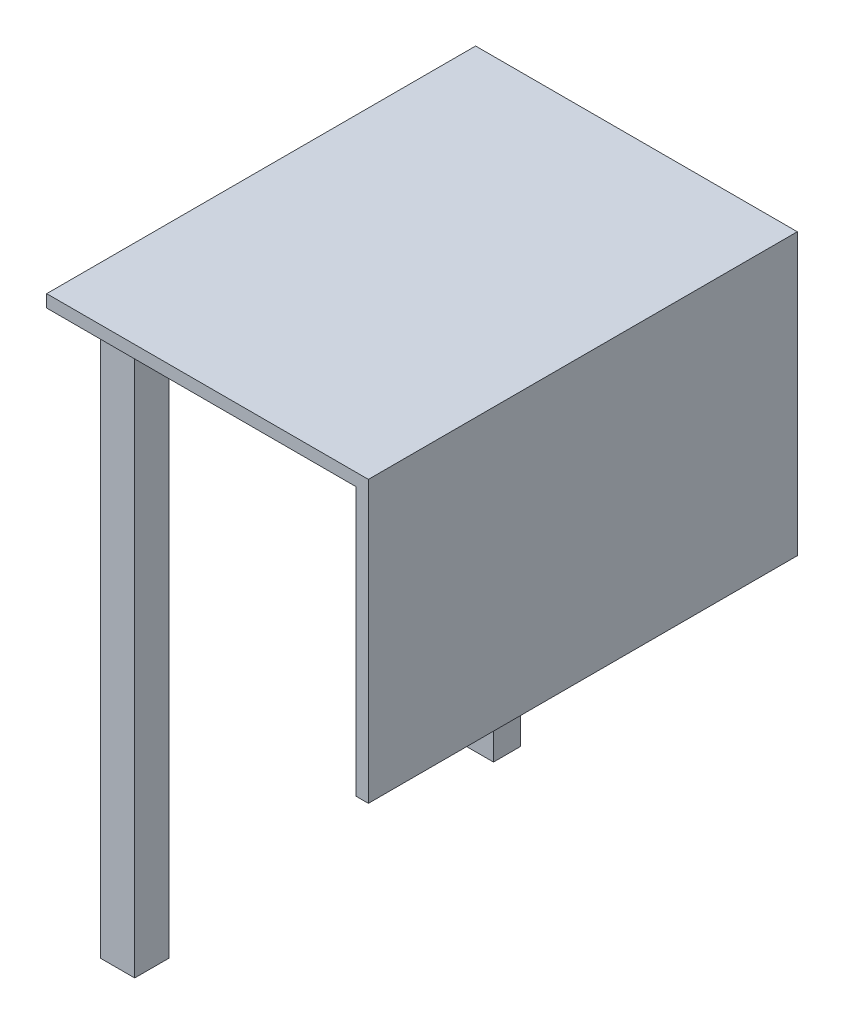
ISO-10303-21;
HEADER;
FILE_DESCRIPTION(('STEP AP214'),'2;1');
FILE_NAME('part.step','',(''),(''),'','','');
FILE_SCHEMA(('AUTOMOTIVE_DESIGN { 1 0 10303 214 1 1 1 1 }'));
ENDSEC;
DATA;
#1=APPLICATION_CONTEXT('core data for automotive mechanical design processes');
#2=APPLICATION_PROTOCOL_DEFINITION('international standard','automotive_design',2000,#1);
#3=PRODUCT_CONTEXT('',#1,'mechanical');
#4=PRODUCT('Part','Part','',(#3));
#5=PRODUCT_RELATED_PRODUCT_CATEGORY('part','',(#4));
#6=PRODUCT_DEFINITION_FORMATION('','',#4);
#7=PRODUCT_DEFINITION_CONTEXT('part definition',#1,'design');
#8=PRODUCT_DEFINITION('design','',#6,#7);
#9=PRODUCT_DEFINITION_SHAPE('','',#8);
#10=(LENGTH_UNIT() NAMED_UNIT(*) SI_UNIT(.MILLI.,.METRE.));
#11=(NAMED_UNIT(*) PLANE_ANGLE_UNIT() SI_UNIT($,.RADIAN.));
#12=(NAMED_UNIT(*) SI_UNIT($,.STERADIAN.) SOLID_ANGLE_UNIT());
#13=UNCERTAINTY_MEASURE_WITH_UNIT(LENGTH_MEASURE(1.E-05),#10,'distance_accuracy_value','');
#14=(GEOMETRIC_REPRESENTATION_CONTEXT(3) GLOBAL_UNCERTAINTY_ASSIGNED_CONTEXT((#13)) GLOBAL_UNIT_ASSIGNED_CONTEXT((#10,
#11,#12)) REPRESENTATION_CONTEXT('',''));
#15=CARTESIAN_POINT('',(0.,0.,0.));
#16=DIRECTION('',(0.,0.,1.));
#17=DIRECTION('',(1.,0.,0.));
#18=AXIS2_PLACEMENT_3D('',#15,#16,#17);
#19=CARTESIAN_POINT('',(0.,17.78,0.));
#20=DIRECTION('',(0.,1.,0.));
#21=DIRECTION('',(0.,0.,1.));
#22=AXIS2_PLACEMENT_3D('',#19,#20,#21);
#23=PLANE('',#22);
#24=DIRECTION('',(0.,0.,-1.));
#25=VECTOR('',#24,1.);
#26=CARTESIAN_POINT('',(228.6,17.78,-304.8));
#27=LINE('',#26,#25);
#28=CARTESIAN_POINT('',(228.6,17.78,304.8));
#29=VERTEX_POINT('',#28);
#30=CARTESIAN_POINT('',(228.6,17.78,-304.8));
#31=VERTEX_POINT('',#30);
#32=EDGE_CURVE('E241',#29,#31,#27,.T.);
#33=ORIENTED_EDGE('',*,*,#32,.T.);
#34=DIRECTION('',(-1.,0.,0.));
#35=VECTOR('',#34,1.);
#36=CARTESIAN_POINT('',(-228.6,17.78,-304.8));
#37=LINE('',#36,#35);
#38=CARTESIAN_POINT('',(-228.6,17.78,-304.8));
#39=VERTEX_POINT('',#38);
#40=EDGE_CURVE('E82',#31,#39,#37,.T.);
#41=ORIENTED_EDGE('',*,*,#40,.T.);
#42=DIRECTION('',(0.,0.,1.));
#43=VECTOR('',#42,1.);
#44=CARTESIAN_POINT('',(-228.6,17.78,-304.8));
#45=LINE('',#44,#43);
#46=CARTESIAN_POINT('',(-228.6,17.78,304.8));
#47=VERTEX_POINT('',#46);
#48=EDGE_CURVE('E245',#39,#47,#45,.T.);
#49=ORIENTED_EDGE('',*,*,#48,.T.);
#50=DIRECTION('',(1.,0.,0.));
#51=VECTOR('',#50,1.);
#52=CARTESIAN_POINT('',(-228.6,17.78,304.8));
#53=LINE('',#52,#51);
#54=EDGE_CURVE('E59',#47,#29,#53,.T.);
#55=ORIENTED_EDGE('',*,*,#54,.T.);
#56=EDGE_LOOP('',(#33,#41,#49,#55));
#57=FACE_BOUND('',#56,.T.);
#58=ADVANCED_FACE('F35',(#57),#23,.T.);
#59=CARTESIAN_POINT('',(0.,0.,0.));
#60=DIRECTION('',(0.,1.,0.));
#61=DIRECTION('',(0.,0.,1.));
#62=AXIS2_PLACEMENT_3D('',#59,#60,#61);
#63=PLANE('',#62);
#64=DIRECTION('',(0.,0.,-1.));
#65=VECTOR('',#64,1.);
#66=CARTESIAN_POINT('',(-139.7,0.,-279.4));
#67=LINE('',#66,#65);
#68=CARTESIAN_POINT('',(-139.7,0.,-241.3));
#69=VERTEX_POINT('',#68);
#70=CARTESIAN_POINT('',(-139.7,0.,-279.4));
#71=VERTEX_POINT('',#70);
#72=EDGE_CURVE('E228',#69,#71,#67,.T.);
#73=ORIENTED_EDGE('',*,*,#72,.T.);
#74=DIRECTION('',(-1.,0.,0.));
#75=VECTOR('',#74,1.);
#76=CARTESIAN_POINT('',(-177.8,0.,-279.4));
#77=LINE('',#76,#75);
#78=CARTESIAN_POINT('',(-177.8,0.,-279.4));
#79=VERTEX_POINT('',#78);
#80=EDGE_CURVE('E231',#71,#79,#77,.T.);
#81=ORIENTED_EDGE('',*,*,#80,.T.);
#82=DIRECTION('',(0.,0.,1.));
#83=VECTOR('',#82,1.);
#84=CARTESIAN_POINT('',(-177.8,0.,-279.4));
#85=LINE('',#84,#83);
#86=CARTESIAN_POINT('',(-177.8,0.,-241.3));
#87=VERTEX_POINT('',#86);
#88=EDGE_CURVE('E234',#79,#87,#85,.T.);
#89=ORIENTED_EDGE('',*,*,#88,.T.);
#90=DIRECTION('',(1.,0.,0.));
#91=VECTOR('',#90,1.);
#92=CARTESIAN_POINT('',(-177.8,0.,-241.3));
#93=LINE('',#92,#91);
#94=EDGE_CURVE('E237',#87,#69,#93,.T.);
#95=ORIENTED_EDGE('',*,*,#94,.T.);
#96=EDGE_LOOP('',(#73,#81,#89,#95));
#97=FACE_BOUND('',#96,.T.);
#98=DIRECTION('',(-1.,0.,0.));
#99=VECTOR('',#98,1.);
#100=CARTESIAN_POINT('',(-228.6,0.,-304.8));
#101=LINE('',#100,#99);
#102=CARTESIAN_POINT('',(210.82,0.,-304.8));
#103=VERTEX_POINT('',#102);
#104=CARTESIAN_POINT('',(-228.6,0.,-304.8));
#105=VERTEX_POINT('',#104);
#106=EDGE_CURVE('E240',#103,#105,#101,.T.);
#107=ORIENTED_EDGE('',*,*,#106,.F.);
#108=DIRECTION('',(0.,0.,1.));
#109=VECTOR('',#108,1.);
#110=CARTESIAN_POINT('',(210.82,0.,-304.8));
#111=LINE('',#110,#109);
#112=CARTESIAN_POINT('',(210.82,0.,304.8));
#113=VERTEX_POINT('',#112);
#114=EDGE_CURVE('E196',#103,#113,#111,.T.);
#115=ORIENTED_EDGE('',*,*,#114,.T.);
#116=DIRECTION('',(1.,0.,0.));
#117=VECTOR('',#116,1.);
#118=CARTESIAN_POINT('',(-228.6,0.,304.8));
#119=LINE('',#118,#117);
#120=CARTESIAN_POINT('',(-228.6,0.,304.8));
#121=VERTEX_POINT('',#120);
#122=EDGE_CURVE('E243',#121,#113,#119,.T.);
#123=ORIENTED_EDGE('',*,*,#122,.F.);
#124=DIRECTION('',(0.,0.,1.));
#125=VECTOR('',#124,1.);
#126=CARTESIAN_POINT('',(-228.6,0.,-304.8));
#127=LINE('',#126,#125);
#128=EDGE_CURVE('E75',#105,#121,#127,.T.);
#129=ORIENTED_EDGE('',*,*,#128,.F.);
#130=EDGE_LOOP('',(#107,#115,#123,#129));
#131=FACE_BOUND('',#130,.T.);
#132=DIRECTION('',(0.,0.,-1.));
#133=VECTOR('',#132,1.);
#134=CARTESIAN_POINT('',(-128.937073181706,0.,230.537073181706));
#135=LINE('',#134,#133);
#136=CARTESIAN_POINT('',(-128.937073181706,0.,279.4));
#137=VERTEX_POINT('',#136);
#138=CARTESIAN_POINT('',(-128.937073181706,0.,230.537073181706));
#139=VERTEX_POINT('',#138);
#140=EDGE_CURVE('E218',#137,#139,#135,.T.);
#141=ORIENTED_EDGE('',*,*,#140,.T.);
#142=DIRECTION('',(-1.,0.,0.));
#143=VECTOR('',#142,1.);
#144=CARTESIAN_POINT('',(-177.8,0.,230.537073181706));
#145=LINE('',#144,#143);
#146=CARTESIAN_POINT('',(-177.8,0.,230.537073181706));
#147=VERTEX_POINT('',#146);
#148=EDGE_CURVE('E222',#139,#147,#145,.T.);
#149=ORIENTED_EDGE('',*,*,#148,.T.);
#150=DIRECTION('',(0.,0.,1.));
#151=VECTOR('',#150,1.);
#152=CARTESIAN_POINT('',(-177.8,0.,230.537073181706));
#153=LINE('',#152,#151);
#154=CARTESIAN_POINT('',(-177.8,0.,279.4));
#155=VERTEX_POINT('',#154);
#156=EDGE_CURVE('E151',#147,#155,#153,.T.);
#157=ORIENTED_EDGE('',*,*,#156,.T.);
#158=DIRECTION('',(1.,0.,0.));
#159=VECTOR('',#158,1.);
#160=CARTESIAN_POINT('',(-177.8,0.,279.4));
#161=LINE('',#160,#159);
#162=EDGE_CURVE('E225',#155,#137,#161,.T.);
#163=ORIENTED_EDGE('',*,*,#162,.T.);
#164=EDGE_LOOP('',(#141,#149,#157,#163));
#165=FACE_BOUND('',#164,.T.);
#166=ADVANCED_FACE('F260',(#97,#131,#165),#63,.F.);
#167=CARTESIAN_POINT('',(228.6,17.78,-304.8));
#168=DIRECTION('',(-1.,0.,0.));
#169=DIRECTION('',(0.,0.,1.));
#170=AXIS2_PLACEMENT_3D('',#167,#168,#169);
#171=PLANE('',#170);
#172=DIRECTION('',(0.,-1.,0.));
#173=VECTOR('',#172,1.);
#174=CARTESIAN_POINT('',(228.6,17.78,304.8));
#175=LINE('',#174,#173);
#176=CARTESIAN_POINT('',(228.6,-381.,304.8));
#177=VERTEX_POINT('',#176);
#178=EDGE_CURVE('E248',#29,#177,#175,.T.);
#179=ORIENTED_EDGE('',*,*,#178,.T.);
#180=DIRECTION('',(0.,0.,-1.));
#181=VECTOR('',#180,1.);
#182=CARTESIAN_POINT('',(228.6,-381.,-304.8));
#183=LINE('',#182,#181);
#184=CARTESIAN_POINT('',(228.6,-381.,-304.8));
#185=VERTEX_POINT('',#184);
#186=EDGE_CURVE('E212',#177,#185,#183,.T.);
#187=ORIENTED_EDGE('',*,*,#186,.T.);
#188=DIRECTION('',(0.,-1.,0.));
#189=VECTOR('',#188,1.);
#190=CARTESIAN_POINT('',(228.6,17.78,-304.8));
#191=LINE('',#190,#189);
#192=EDGE_CURVE('E11',#31,#185,#191,.T.);
#193=ORIENTED_EDGE('',*,*,#192,.F.);
#194=ORIENTED_EDGE('',*,*,#32,.F.);
#195=EDGE_LOOP('',(#179,#187,#193,#194));
#196=FACE_BOUND('',#195,.T.);
#197=ADVANCED_FACE('F37',(#196),#171,.F.);
#198=CARTESIAN_POINT('',(-228.6,17.78,-304.8));
#199=DIRECTION('',(0.,0.,1.));
#200=DIRECTION('',(1.,0.,0.));
#201=AXIS2_PLACEMENT_3D('',#198,#199,#200);
#202=PLANE('',#201);
#203=ORIENTED_EDGE('',*,*,#192,.T.);
#204=DIRECTION('',(-1.,0.,0.));
#205=VECTOR('',#204,1.);
#206=CARTESIAN_POINT('',(210.82,-381.,-304.8));
#207=LINE('',#206,#205);
#208=CARTESIAN_POINT('',(210.82,-381.,-304.8));
#209=VERTEX_POINT('',#208);
#210=EDGE_CURVE('E204',#185,#209,#207,.T.);
#211=ORIENTED_EDGE('',*,*,#210,.T.);
#212=DIRECTION('',(0.,1.,0.));
#213=VECTOR('',#212,1.);
#214=CARTESIAN_POINT('',(210.82,-381.,-304.8));
#215=LINE('',#214,#213);
#216=EDGE_CURVE('E215',#209,#103,#215,.T.);
#217=ORIENTED_EDGE('',*,*,#216,.T.);
#218=ORIENTED_EDGE('',*,*,#106,.T.);
#219=DIRECTION('',(0.,-1.,0.));
#220=VECTOR('',#219,1.);
#221=CARTESIAN_POINT('',(-228.6,17.78,-304.8));
#222=LINE('',#221,#220);
#223=EDGE_CURVE('E43',#39,#105,#222,.T.);
#224=ORIENTED_EDGE('',*,*,#223,.F.);
#225=ORIENTED_EDGE('',*,*,#40,.F.);
#226=EDGE_LOOP('',(#203,#211,#217,#218,#224,#225));
#227=FACE_BOUND('',#226,.T.);
#228=ADVANCED_FACE('F283',(#227),#202,.F.);
#229=CARTESIAN_POINT('',(-228.6,17.78,-304.8));
#230=DIRECTION('',(1.,0.,0.));
#231=DIRECTION('',(0.,0.,-1.));
#232=AXIS2_PLACEMENT_3D('',#229,#230,#231);
#233=PLANE('',#232);
#234=ORIENTED_EDGE('',*,*,#128,.T.);
#235=DIRECTION('',(0.,-1.,0.));
#236=VECTOR('',#235,1.);
#237=CARTESIAN_POINT('',(-228.6,17.78,304.8));
#238=LINE('',#237,#236);
#239=EDGE_CURVE('E254',#47,#121,#238,.T.);
#240=ORIENTED_EDGE('',*,*,#239,.F.);
#241=ORIENTED_EDGE('',*,*,#48,.F.);
#242=ORIENTED_EDGE('',*,*,#223,.T.);
#243=EDGE_LOOP('',(#234,#240,#241,#242));
#244=FACE_BOUND('',#243,.T.);
#245=ADVANCED_FACE('F256',(#244),#233,.F.);
#246=CARTESIAN_POINT('',(-228.6,17.78,304.8));
#247=DIRECTION('',(0.,0.,-1.));
#248=DIRECTION('',(-1.,0.,0.));
#249=AXIS2_PLACEMENT_3D('',#246,#247,#248);
#250=PLANE('',#249);
#251=ORIENTED_EDGE('',*,*,#122,.T.);
#252=DIRECTION('',(0.,1.,0.));
#253=VECTOR('',#252,1.);
#254=CARTESIAN_POINT('',(210.82,-381.,304.8));
#255=LINE('',#254,#253);
#256=CARTESIAN_POINT('',(210.82,-381.,304.8));
#257=VERTEX_POINT('',#256);
#258=EDGE_CURVE('E50',#257,#113,#255,.T.);
#259=ORIENTED_EDGE('',*,*,#258,.F.);
#260=DIRECTION('',(1.,0.,0.));
#261=VECTOR('',#260,1.);
#262=CARTESIAN_POINT('',(228.6,-381.,304.8));
#263=LINE('',#262,#261);
#264=EDGE_CURVE('E209',#257,#177,#263,.T.);
#265=ORIENTED_EDGE('',*,*,#264,.T.);
#266=ORIENTED_EDGE('',*,*,#178,.F.);
#267=ORIENTED_EDGE('',*,*,#54,.F.);
#268=ORIENTED_EDGE('',*,*,#239,.T.);
#269=EDGE_LOOP('',(#251,#259,#265,#266,#267,#268));
#270=FACE_BOUND('',#269,.T.);
#271=ADVANCED_FACE('F263',(#270),#250,.F.);
#272=CARTESIAN_POINT('',(210.82,-381.,-304.8));
#273=DIRECTION('',(-1.,0.,0.));
#274=DIRECTION('',(0.,0.,1.));
#275=AXIS2_PLACEMENT_3D('',#272,#273,#274);
#276=PLANE('',#275);
#277=ORIENTED_EDGE('',*,*,#114,.F.);
#278=ORIENTED_EDGE('',*,*,#216,.F.);
#279=DIRECTION('',(0.,0.,1.));
#280=VECTOR('',#279,1.);
#281=CARTESIAN_POINT('',(210.82,-381.,-304.8));
#282=LINE('',#281,#280);
#283=EDGE_CURVE('E207',#209,#257,#282,.T.);
#284=ORIENTED_EDGE('',*,*,#283,.T.);
#285=ORIENTED_EDGE('',*,*,#258,.T.);
#286=EDGE_LOOP('',(#277,#278,#284,#285));
#287=FACE_BOUND('',#286,.T.);
#288=ADVANCED_FACE('F277',(#287),#276,.T.);
#289=CARTESIAN_POINT('',(0.,-381.,0.));
#290=DIRECTION('',(0.,-1.,0.));
#291=DIRECTION('',(0.,0.,-1.));
#292=AXIS2_PLACEMENT_3D('',#289,#290,#291);
#293=PLANE('',#292);
#294=ORIENTED_EDGE('',*,*,#210,.F.);
#295=ORIENTED_EDGE('',*,*,#186,.F.);
#296=ORIENTED_EDGE('',*,*,#264,.F.);
#297=ORIENTED_EDGE('',*,*,#283,.F.);
#298=EDGE_LOOP('',(#294,#295,#296,#297));
#299=FACE_BOUND('',#298,.T.);
#300=ADVANCED_FACE('F291',(#299),#293,.T.);
#301=CARTESIAN_POINT('',(-177.8,-787.4,-279.4));
#302=DIRECTION('',(0.,0.,-1.));
#303=DIRECTION('',(-1.,0.,0.));
#304=AXIS2_PLACEMENT_3D('',#301,#302,#303);
#305=PLANE('',#304);
#306=ORIENTED_EDGE('',*,*,#80,.F.);
#307=DIRECTION('',(0.,1.,0.));
#308=VECTOR('',#307,1.);
#309=CARTESIAN_POINT('',(-139.7,-787.4,-279.4));
#310=LINE('',#309,#308);
#311=CARTESIAN_POINT('',(-139.7,-787.4,-279.4));
#312=VERTEX_POINT('',#311);
#313=EDGE_CURVE('E193',#312,#71,#310,.T.);
#314=ORIENTED_EDGE('',*,*,#313,.F.);
#315=DIRECTION('',(-1.,0.,0.));
#316=VECTOR('',#315,1.);
#317=CARTESIAN_POINT('',(-177.8,-787.4,-279.4));
#318=LINE('',#317,#316);
#319=CARTESIAN_POINT('',(-177.8,-787.4,-279.4));
#320=VERTEX_POINT('',#319);
#321=EDGE_CURVE('E176',#312,#320,#318,.T.);
#322=ORIENTED_EDGE('',*,*,#321,.T.);
#323=DIRECTION('',(0.,1.,0.));
#324=VECTOR('',#323,1.);
#325=CARTESIAN_POINT('',(-177.8,-787.4,-279.4));
#326=LINE('',#325,#324);
#327=EDGE_CURVE('E192',#320,#79,#326,.T.);
#328=ORIENTED_EDGE('',*,*,#327,.T.);
#329=EDGE_LOOP('',(#306,#314,#322,#328));
#330=FACE_BOUND('',#329,.T.);
#331=ADVANCED_FACE('F296',(#330),#305,.T.);
#332=CARTESIAN_POINT('',(-177.8,-787.4,-241.3));
#333=DIRECTION('',(0.,0.,1.));
#334=DIRECTION('',(1.,0.,0.));
#335=AXIS2_PLACEMENT_3D('',#332,#333,#334);
#336=PLANE('',#335);
#337=ORIENTED_EDGE('',*,*,#94,.F.);
#338=DIRECTION('',(0.,1.,0.));
#339=VECTOR('',#338,1.);
#340=CARTESIAN_POINT('',(-177.8,-787.4,-241.3));
#341=LINE('',#340,#339);
#342=CARTESIAN_POINT('',(-177.8,-787.4,-241.3));
#343=VERTEX_POINT('',#342);
#344=EDGE_CURVE('E200',#343,#87,#341,.T.);
#345=ORIENTED_EDGE('',*,*,#344,.F.);
#346=DIRECTION('',(1.,0.,0.));
#347=VECTOR('',#346,1.);
#348=CARTESIAN_POINT('',(-177.8,-787.4,-241.3));
#349=LINE('',#348,#347);
#350=CARTESIAN_POINT('',(-139.7,-787.4,-241.3));
#351=VERTEX_POINT('',#350);
#352=EDGE_CURVE('E186',#343,#351,#349,.T.);
#353=ORIENTED_EDGE('',*,*,#352,.T.);
#354=DIRECTION('',(0.,1.,0.));
#355=VECTOR('',#354,1.);
#356=CARTESIAN_POINT('',(-139.7,-787.4,-241.3));
#357=LINE('',#356,#355);
#358=EDGE_CURVE('E197',#351,#69,#357,.T.);
#359=ORIENTED_EDGE('',*,*,#358,.T.);
#360=EDGE_LOOP('',(#337,#345,#353,#359));
#361=FACE_BOUND('',#360,.T.);
#362=ADVANCED_FACE('F300',(#361),#336,.T.);
#363=CARTESIAN_POINT('',(-139.7,-787.4,-279.4));
#364=DIRECTION('',(1.,0.,0.));
#365=DIRECTION('',(0.,0.,-1.));
#366=AXIS2_PLACEMENT_3D('',#363,#364,#365);
#367=PLANE('',#366);
#368=ORIENTED_EDGE('',*,*,#72,.F.);
#369=ORIENTED_EDGE('',*,*,#358,.F.);
#370=DIRECTION('',(0.,0.,-1.));
#371=VECTOR('',#370,1.);
#372=CARTESIAN_POINT('',(-139.7,-787.4,-279.4));
#373=LINE('',#372,#371);
#374=EDGE_CURVE('E189',#351,#312,#373,.T.);
#375=ORIENTED_EDGE('',*,*,#374,.T.);
#376=ORIENTED_EDGE('',*,*,#313,.T.);
#377=EDGE_LOOP('',(#368,#369,#375,#376));
#378=FACE_BOUND('',#377,.T.);
#379=ADVANCED_FACE('F308',(#378),#367,.T.);
#380=CARTESIAN_POINT('',(-177.8,-787.4,-279.4));
#381=DIRECTION('',(-1.,0.,0.));
#382=DIRECTION('',(0.,0.,1.));
#383=AXIS2_PLACEMENT_3D('',#380,#381,#382);
#384=PLANE('',#383);
#385=ORIENTED_EDGE('',*,*,#88,.F.);
#386=ORIENTED_EDGE('',*,*,#327,.F.);
#387=DIRECTION('',(0.,0.,1.));
#388=VECTOR('',#387,1.);
#389=CARTESIAN_POINT('',(-177.8,-787.4,-279.4));
#390=LINE('',#389,#388);
#391=EDGE_CURVE('E183',#320,#343,#390,.T.);
#392=ORIENTED_EDGE('',*,*,#391,.T.);
#393=ORIENTED_EDGE('',*,*,#344,.T.);
#394=EDGE_LOOP('',(#385,#386,#392,#393));
#395=FACE_BOUND('',#394,.T.);
#396=ADVANCED_FACE('F304',(#395),#384,.T.);
#397=CARTESIAN_POINT('',(0.,-787.4,0.));
#398=DIRECTION('',(0.,-1.,0.));
#399=DIRECTION('',(0.,0.,-1.));
#400=AXIS2_PLACEMENT_3D('',#397,#398,#399);
#401=PLANE('',#400);
#402=ORIENTED_EDGE('',*,*,#321,.F.);
#403=ORIENTED_EDGE('',*,*,#374,.F.);
#404=ORIENTED_EDGE('',*,*,#352,.F.);
#405=ORIENTED_EDGE('',*,*,#391,.F.);
#406=EDGE_LOOP('',(#402,#403,#404,#405));
#407=FACE_BOUND('',#406,.T.);
#408=ADVANCED_FACE('F307',(#407),#401,.T.);
#409=CARTESIAN_POINT('',(-177.8,-787.4,230.537073181706));
#410=DIRECTION('',(0.,0.,-1.));
#411=DIRECTION('',(-1.,0.,0.));
#412=AXIS2_PLACEMENT_3D('',#409,#410,#411);
#413=PLANE('',#412);
#414=ORIENTED_EDGE('',*,*,#148,.F.);
#415=DIRECTION('',(0.,1.,0.));
#416=VECTOR('',#415,1.);
#417=CARTESIAN_POINT('',(-128.937073181706,-787.4,230.537073181706));
#418=LINE('',#417,#416);
#419=CARTESIAN_POINT('',(-128.937073181706,-787.4,230.537073181706));
#420=VERTEX_POINT('',#419);
#421=EDGE_CURVE('E170',#420,#139,#418,.T.);
#422=ORIENTED_EDGE('',*,*,#421,.F.);
#423=DIRECTION('',(-1.,0.,0.));
#424=VECTOR('',#423,1.);
#425=CARTESIAN_POINT('',(-177.8,-787.4,230.537073181706));
#426=LINE('',#425,#424);
#427=CARTESIAN_POINT('',(-177.8,-787.4,230.537073181706));
#428=VERTEX_POINT('',#427);
#429=EDGE_CURVE('E163',#420,#428,#426,.T.);
#430=ORIENTED_EDGE('',*,*,#429,.T.);
#431=DIRECTION('',(0.,1.,0.));
#432=VECTOR('',#431,1.);
#433=CARTESIAN_POINT('',(-177.8,-787.4,230.537073181706));
#434=LINE('',#433,#432);
#435=EDGE_CURVE('E146',#428,#147,#434,.T.);
#436=ORIENTED_EDGE('',*,*,#435,.T.);
#437=EDGE_LOOP('',(#414,#422,#430,#436));
#438=FACE_BOUND('',#437,.T.);
#439=ADVANCED_FACE('F168',(#438),#413,.T.);
#440=CARTESIAN_POINT('',(-177.8,-787.4,279.4));
#441=DIRECTION('',(0.,0.,1.));
#442=DIRECTION('',(1.,0.,0.));
#443=AXIS2_PLACEMENT_3D('',#440,#441,#442);
#444=PLANE('',#443);
#445=ORIENTED_EDGE('',*,*,#162,.F.);
#446=DIRECTION('',(0.,1.,0.));
#447=VECTOR('',#446,1.);
#448=CARTESIAN_POINT('',(-177.8,-787.4,279.4));
#449=LINE('',#448,#447);
#450=CARTESIAN_POINT('',(-177.8,-787.4,279.4));
#451=VERTEX_POINT('',#450);
#452=EDGE_CURVE('E155',#451,#155,#449,.T.);
#453=ORIENTED_EDGE('',*,*,#452,.F.);
#454=DIRECTION('',(1.,0.,0.));
#455=VECTOR('',#454,1.);
#456=CARTESIAN_POINT('',(-177.8,-787.4,279.4));
#457=LINE('',#456,#455);
#458=CARTESIAN_POINT('',(-128.937073181706,-787.4,279.4));
#459=VERTEX_POINT('',#458);
#460=EDGE_CURVE('E166',#451,#459,#457,.T.);
#461=ORIENTED_EDGE('',*,*,#460,.T.);
#462=DIRECTION('',(0.,1.,0.));
#463=VECTOR('',#462,1.);
#464=CARTESIAN_POINT('',(-128.937073181706,-787.4,279.4));
#465=LINE('',#464,#463);
#466=EDGE_CURVE('E177',#459,#137,#465,.T.);
#467=ORIENTED_EDGE('',*,*,#466,.T.);
#468=EDGE_LOOP('',(#445,#453,#461,#467));
#469=FACE_BOUND('',#468,.T.);
#470=ADVANCED_FACE('F321',(#469),#444,.T.);
#471=CARTESIAN_POINT('',(-128.937073181706,-787.4,230.537073181706));
#472=DIRECTION('',(1.,0.,0.));
#473=DIRECTION('',(0.,0.,-1.));
#474=AXIS2_PLACEMENT_3D('',#471,#472,#473);
#475=PLANE('',#474);
#476=ORIENTED_EDGE('',*,*,#140,.F.);
#477=ORIENTED_EDGE('',*,*,#466,.F.);
#478=DIRECTION('',(0.,0.,-1.));
#479=VECTOR('',#478,1.);
#480=CARTESIAN_POINT('',(-128.937073181706,-787.4,230.537073181706));
#481=LINE('',#480,#479);
#482=EDGE_CURVE('E156',#459,#420,#481,.T.);
#483=ORIENTED_EDGE('',*,*,#482,.T.);
#484=ORIENTED_EDGE('',*,*,#421,.T.);
#485=EDGE_LOOP('',(#476,#477,#483,#484));
#486=FACE_BOUND('',#485,.T.);
#487=ADVANCED_FACE('F324',(#486),#475,.T.);
#488=CARTESIAN_POINT('',(-177.8,-787.4,230.537073181706));
#489=DIRECTION('',(-1.,0.,0.));
#490=DIRECTION('',(0.,0.,1.));
#491=AXIS2_PLACEMENT_3D('',#488,#489,#490);
#492=PLANE('',#491);
#493=ORIENTED_EDGE('',*,*,#156,.F.);
#494=ORIENTED_EDGE('',*,*,#435,.F.);
#495=DIRECTION('',(0.,0.,1.));
#496=VECTOR('',#495,1.);
#497=CARTESIAN_POINT('',(-177.8,-787.4,230.537073181706));
#498=LINE('',#497,#496);
#499=EDGE_CURVE('E149',#428,#451,#498,.T.);
#500=ORIENTED_EDGE('',*,*,#499,.T.);
#501=ORIENTED_EDGE('',*,*,#452,.T.);
#502=EDGE_LOOP('',(#493,#494,#500,#501));
#503=FACE_BOUND('',#502,.T.);
#504=ADVANCED_FACE('F148',(#503),#492,.T.);
#505=CARTESIAN_POINT('',(0.,-787.4,0.));
#506=DIRECTION('',(0.,-1.,0.));
#507=DIRECTION('',(0.,0.,-1.));
#508=AXIS2_PLACEMENT_3D('',#505,#506,#507);
#509=PLANE('',#508);
#510=ORIENTED_EDGE('',*,*,#429,.F.);
#511=ORIENTED_EDGE('',*,*,#482,.F.);
#512=ORIENTED_EDGE('',*,*,#460,.F.);
#513=ORIENTED_EDGE('',*,*,#499,.F.);
#514=EDGE_LOOP('',(#510,#511,#512,#513));
#515=FACE_BOUND('',#514,.T.);
#516=ADVANCED_FACE('F161',(#515),#509,.T.);
#517=CLOSED_SHELL('',(#58,#166,#197,#228,#245,#271,#288,#300,#331,#362,#379,#396,#408,#439,#470,
#487,#504,#516));
#518=MANIFOLD_SOLID_BREP('B2',#517);
#519=ADVANCED_BREP_SHAPE_REPRESENTATION('',(#18,#518),#14);
#520=SHAPE_DEFINITION_REPRESENTATION(#9,#519);
ENDSEC;
END-ISO-10303-21;
